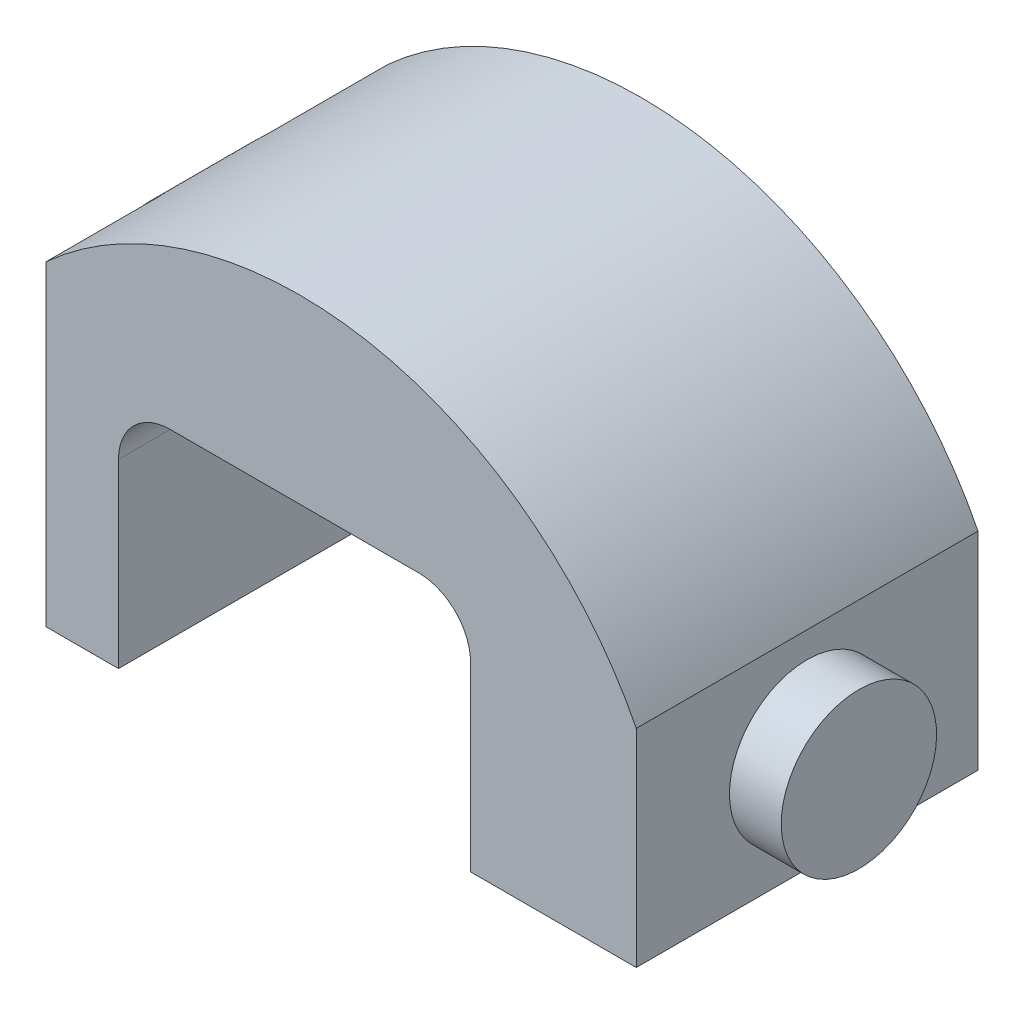
ISO-10303-21;
HEADER;
FILE_DESCRIPTION(('STEP AP214'),'2;1');
FILE_NAME('part.step','',(''),(''),'','','');
FILE_SCHEMA(('AUTOMOTIVE_DESIGN { 1 0 10303 214 1 1 1 1 }'));
ENDSEC;
DATA;
#1=APPLICATION_CONTEXT('core data for automotive mechanical design processes');
#2=APPLICATION_PROTOCOL_DEFINITION('international standard','automotive_design',2000,#1);
#3=PRODUCT_CONTEXT('',#1,'mechanical');
#4=PRODUCT('Part','Part','',(#3));
#5=PRODUCT_RELATED_PRODUCT_CATEGORY('part','',(#4));
#6=PRODUCT_DEFINITION_FORMATION('','',#4);
#7=PRODUCT_DEFINITION_CONTEXT('part definition',#1,'design');
#8=PRODUCT_DEFINITION('design','',#6,#7);
#9=PRODUCT_DEFINITION_SHAPE('','',#8);
#10=(LENGTH_UNIT() NAMED_UNIT(*) SI_UNIT(.MILLI.,.METRE.));
#11=(NAMED_UNIT(*) PLANE_ANGLE_UNIT() SI_UNIT($,.RADIAN.));
#12=(NAMED_UNIT(*) SI_UNIT($,.STERADIAN.) SOLID_ANGLE_UNIT());
#13=UNCERTAINTY_MEASURE_WITH_UNIT(LENGTH_MEASURE(1.E-05),#10,'distance_accuracy_value','');
#14=(GEOMETRIC_REPRESENTATION_CONTEXT(3) GLOBAL_UNCERTAINTY_ASSIGNED_CONTEXT((#13)) GLOBAL_UNIT_ASSIGNED_CONTEXT((#10,
#11,#12)) REPRESENTATION_CONTEXT('',''));
#15=CARTESIAN_POINT('',(0.,0.,0.));
#16=DIRECTION('',(0.,0.,1.));
#17=DIRECTION('',(1.,0.,0.));
#18=AXIS2_PLACEMENT_3D('',#15,#16,#17);
#19=CARTESIAN_POINT('',(0.,-40.,66.));
#20=DIRECTION('',(0.,1.,0.));
#21=DIRECTION('',(0.,0.,1.));
#22=AXIS2_PLACEMENT_3D('',#19,#20,#21);
#23=PLANE('',#22);
#24=DIRECTION('',(0.,0.,-1.));
#25=VECTOR('',#24,1.);
#26=CARTESIAN_POINT('',(35.5,-40.,19.9));
#27=LINE('',#26,#25);
#28=CARTESIAN_POINT('',(35.5,-40.,19.9));
#29=VERTEX_POINT('',#28);
#30=CARTESIAN_POINT('',(35.5,-40.,7.9));
#31=VERTEX_POINT('',#30);
#32=EDGE_CURVE('E223',#29,#31,#27,.T.);
#33=ORIENTED_EDGE('',*,*,#32,.F.);
#34=DIRECTION('',(-1.,0.,0.));
#35=VECTOR('',#34,1.);
#36=CARTESIAN_POINT('',(35.5,-40.,19.9));
#37=LINE('',#36,#35);
#38=CARTESIAN_POINT('',(47.5,-40.,19.9));
#39=VERTEX_POINT('',#38);
#40=EDGE_CURVE('E266',#39,#29,#37,.T.);
#41=ORIENTED_EDGE('',*,*,#40,.F.);
#42=DIRECTION('',(0.,0.,1.));
#43=VECTOR('',#42,1.);
#44=CARTESIAN_POINT('',(47.5,-40.,19.9));
#45=LINE('',#44,#43);
#46=CARTESIAN_POINT('',(47.5,-40.,7.9));
#47=VERTEX_POINT('',#46);
#48=EDGE_CURVE('E283',#47,#39,#45,.T.);
#49=ORIENTED_EDGE('',*,*,#48,.F.);
#50=DIRECTION('',(1.,0.,0.));
#51=VECTOR('',#50,1.);
#52=CARTESIAN_POINT('',(35.5,-40.,7.9));
#53=LINE('',#52,#51);
#54=EDGE_CURVE('E279',#31,#47,#53,.T.);
#55=ORIENTED_EDGE('',*,*,#54,.F.);
#56=EDGE_LOOP('',(#33,#41,#49,#55));
#57=FACE_BOUND('',#56,.T.);
#58=DIRECTION('',(1.,0.,0.));
#59=VECTOR('',#58,1.);
#60=CARTESIAN_POINT('',(0.,-40.,66.));
#61=LINE('',#60,#59);
#62=CARTESIAN_POINT('',(33.,-40.,66.));
#63=VERTEX_POINT('',#62);
#64=CARTESIAN_POINT('',(65.,-40.,66.));
#65=VERTEX_POINT('',#64);
#66=EDGE_CURVE('E461',#63,#65,#61,.T.);
#67=ORIENTED_EDGE('',*,*,#66,.F.);
#68=DIRECTION('',(0.,0.,1.));
#69=VECTOR('',#68,1.);
#70=CARTESIAN_POINT('',(33.,-40.,0.));
#71=LINE('',#70,#69);
#72=CARTESIAN_POINT('',(33.,-40.,0.));
#73=VERTEX_POINT('',#72);
#74=EDGE_CURVE('E430',#73,#63,#71,.T.);
#75=ORIENTED_EDGE('',*,*,#74,.F.);
#76=DIRECTION('',(1.,0.,0.));
#77=VECTOR('',#76,1.);
#78=CARTESIAN_POINT('',(0.,-40.,0.));
#79=LINE('',#78,#77);
#80=CARTESIAN_POINT('',(65.,-40.,0.));
#81=VERTEX_POINT('',#80);
#82=EDGE_CURVE('E473',#73,#81,#79,.T.);
#83=ORIENTED_EDGE('',*,*,#82,.T.);
#84=DIRECTION('',(0.,0.,-1.));
#85=VECTOR('',#84,1.);
#86=CARTESIAN_POINT('',(65.,-40.,66.));
#87=LINE('',#86,#85);
#88=EDGE_CURVE('E483',#65,#81,#87,.T.);
#89=ORIENTED_EDGE('',*,*,#88,.F.);
#90=EDGE_LOOP('',(#67,#75,#83,#89));
#91=FACE_BOUND('',#90,.T.);
#92=DIRECTION('',(0.,0.,-1.));
#93=VECTOR('',#92,1.);
#94=CARTESIAN_POINT('',(35.5,-40.,46.1));
#95=LINE('',#94,#93);
#96=CARTESIAN_POINT('',(35.5,-40.,58.1));
#97=VERTEX_POINT('',#96);
#98=CARTESIAN_POINT('',(35.5,-40.,46.1));
#99=VERTEX_POINT('',#98);
#100=EDGE_CURVE('E216',#97,#99,#95,.T.);
#101=ORIENTED_EDGE('',*,*,#100,.F.);
#102=DIRECTION('',(-1.,0.,0.));
#103=VECTOR('',#102,1.);
#104=CARTESIAN_POINT('',(47.5,-40.,58.1));
#105=LINE('',#104,#103);
#106=CARTESIAN_POINT('',(47.5,-40.,58.1));
#107=VERTEX_POINT('',#106);
#108=EDGE_CURVE('E218',#107,#97,#105,.T.);
#109=ORIENTED_EDGE('',*,*,#108,.F.);
#110=DIRECTION('',(0.,0.,1.));
#111=VECTOR('',#110,1.);
#112=CARTESIAN_POINT('',(47.5,-40.,46.1));
#113=LINE('',#112,#111);
#114=CARTESIAN_POINT('',(47.5,-40.,46.1));
#115=VERTEX_POINT('',#114);
#116=EDGE_CURVE('E68',#115,#107,#113,.T.);
#117=ORIENTED_EDGE('',*,*,#116,.F.);
#118=DIRECTION('',(1.,0.,0.));
#119=VECTOR('',#118,1.);
#120=CARTESIAN_POINT('',(47.5,-40.,46.1));
#121=LINE('',#120,#119);
#122=EDGE_CURVE('E63',#99,#115,#121,.T.);
#123=ORIENTED_EDGE('',*,*,#122,.F.);
#124=EDGE_LOOP('',(#101,#109,#117,#123));
#125=FACE_BOUND('',#124,.T.);
#126=ADVANCED_FACE('F47',(#57,#91,#125),#23,.F.);
#127=CARTESIAN_POINT('',(-49.,-40.,66.));
#128=VERTEX_POINT('',#127);
#129=CARTESIAN_POINT('',(-35.,-40.,66.));
#130=VERTEX_POINT('',#129);
#131=EDGE_CURVE('E463',#128,#130,#61,.T.);
#132=ORIENTED_EDGE('',*,*,#131,.F.);
#133=DIRECTION('',(0.,0.,1.));
#134=VECTOR('',#133,1.);
#135=CARTESIAN_POINT('',(-49.,-40.,66.));
#136=LINE('',#135,#134);
#137=CARTESIAN_POINT('',(-49.,-40.,43.));
#138=VERTEX_POINT('',#137);
#139=EDGE_CURVE('E355',#138,#128,#136,.T.);
#140=ORIENTED_EDGE('',*,*,#139,.F.);
#141=DIRECTION('',(1.,0.,0.));
#142=VECTOR('',#141,1.);
#143=CARTESIAN_POINT('',(-65.,-40.,43.));
#144=LINE('',#143,#142);
#145=CARTESIAN_POINT('',(-65.,-40.,43.));
#146=VERTEX_POINT('',#145);
#147=EDGE_CURVE('E351',#146,#138,#144,.T.);
#148=ORIENTED_EDGE('',*,*,#147,.F.);
#149=DIRECTION('',(0.,0.,-1.));
#150=VECTOR('',#149,1.);
#151=CARTESIAN_POINT('',(-65.,-40.,66.));
#152=LINE('',#151,#150);
#153=CARTESIAN_POINT('',(-65.,-40.,23.));
#154=VERTEX_POINT('',#153);
#155=EDGE_CURVE('E487',#146,#154,#152,.T.);
#156=ORIENTED_EDGE('',*,*,#155,.T.);
#157=DIRECTION('',(-1.,0.,0.));
#158=VECTOR('',#157,1.);
#159=CARTESIAN_POINT('',(-65.,-40.,23.));
#160=LINE('',#159,#158);
#161=CARTESIAN_POINT('',(-49.,-40.,23.));
#162=VERTEX_POINT('',#161);
#163=EDGE_CURVE('E369',#162,#154,#160,.T.);
#164=ORIENTED_EDGE('',*,*,#163,.F.);
#165=DIRECTION('',(0.,0.,1.));
#166=VECTOR('',#165,1.);
#167=CARTESIAN_POINT('',(-49.,-40.,0.));
#168=LINE('',#167,#166);
#169=CARTESIAN_POINT('',(-49.,-40.,0.));
#170=VERTEX_POINT('',#169);
#171=EDGE_CURVE('E356',#170,#162,#168,.T.);
#172=ORIENTED_EDGE('',*,*,#171,.F.);
#173=CARTESIAN_POINT('',(-35.,-40.,0.));
#174=VERTEX_POINT('',#173);
#175=EDGE_CURVE('E474',#170,#174,#79,.T.);
#176=ORIENTED_EDGE('',*,*,#175,.T.);
#177=DIRECTION('',(0.,0.,1.));
#178=VECTOR('',#177,1.);
#179=CARTESIAN_POINT('',(-35.,-40.,0.));
#180=LINE('',#179,#178);
#181=EDGE_CURVE('E434',#174,#130,#180,.T.);
#182=ORIENTED_EDGE('',*,*,#181,.T.);
#183=EDGE_LOOP('',(#132,#140,#148,#156,#164,#172,#176,#182));
#184=FACE_BOUND('',#183,.T.);
#185=DIRECTION('',(0.,0.,-1.));
#186=VECTOR('',#185,1.);
#187=CARTESIAN_POINT('',(-53.5,-40.,38.));
#188=LINE('',#187,#186);
#189=CARTESIAN_POINT('',(-53.5,-40.,38.));
#190=VERTEX_POINT('',#189);
#191=CARTESIAN_POINT('',(-53.5,-40.,28.));
#192=VERTEX_POINT('',#191);
#193=EDGE_CURVE('E305',#190,#192,#188,.T.);
#194=ORIENTED_EDGE('',*,*,#193,.F.);
#195=DIRECTION('',(-1.,0.,0.));
#196=VECTOR('',#195,1.);
#197=CARTESIAN_POINT('',(-53.5,-40.,38.));
#198=LINE('',#197,#196);
#199=CARTESIAN_POINT('',(-43.5,-40.,38.));
#200=VERTEX_POINT('',#199);
#201=EDGE_CURVE('E311',#200,#190,#198,.T.);
#202=ORIENTED_EDGE('',*,*,#201,.F.);
#203=DIRECTION('',(0.,0.,1.));
#204=VECTOR('',#203,1.);
#205=CARTESIAN_POINT('',(-43.5,-40.,38.));
#206=LINE('',#205,#204);
#207=CARTESIAN_POINT('',(-43.5,-40.,28.));
#208=VERTEX_POINT('',#207);
#209=EDGE_CURVE('E328',#208,#200,#206,.T.);
#210=ORIENTED_EDGE('',*,*,#209,.F.);
#211=DIRECTION('',(1.,0.,0.));
#212=VECTOR('',#211,1.);
#213=CARTESIAN_POINT('',(-53.5,-40.,28.));
#214=LINE('',#213,#212);
#215=EDGE_CURVE('E324',#192,#208,#214,.T.);
#216=ORIENTED_EDGE('',*,*,#215,.F.);
#217=EDGE_LOOP('',(#194,#202,#210,#216));
#218=FACE_BOUND('',#217,.T.);
#219=ADVANCED_FACE('F524',(#184,#218),#23,.F.);
#220=CARTESIAN_POINT('',(0.,-32.8125,66.));
#221=DIRECTION('',(0.,0.,-1.));
#222=DIRECTION('',(-1.,0.,0.));
#223=AXIS2_PLACEMENT_3D('',#220,#221,#222);
#224=CYLINDRICAL_SURFACE('',#223,72.8125);
#225=DIRECTION('',(0.,0.,-1.));
#226=VECTOR('',#225,1.);
#227=CARTESIAN_POINT('',(-49.,21.0452771194653,66.));
#228=LINE('',#227,#226);
#229=CARTESIAN_POINT('',(-49.,21.0452771194653,66.));
#230=VERTEX_POINT('',#229);
#231=CARTESIAN_POINT('',(-49.,21.0452771194653,43.));
#232=VERTEX_POINT('',#231);
#233=EDGE_CURVE('E380',#230,#232,#228,.T.);
#234=ORIENTED_EDGE('',*,*,#233,.F.);
#235=CARTESIAN_POINT('',(0.,-32.8125,66.));
#236=DIRECTION('',(0.,0.,1.));
#237=DIRECTION('',(1.,0.,0.));
#238=AXIS2_PLACEMENT_3D('',#235,#236,#237);
#239=CIRCLE('',#238,72.8125);
#240=CARTESIAN_POINT('',(65.,0.,66.));
#241=VERTEX_POINT('',#240);
#242=EDGE_CURVE('E458',#230,#241,#239,.F.);
#243=ORIENTED_EDGE('',*,*,#242,.T.);
#244=DIRECTION('',(0.,0.,-1.));
#245=VECTOR('',#244,1.);
#246=CARTESIAN_POINT('',(65.,0.,66.));
#247=LINE('',#246,#245);
#248=CARTESIAN_POINT('',(65.,0.,0.));
#249=VERTEX_POINT('',#248);
#250=EDGE_CURVE('E470',#241,#249,#247,.T.);
#251=ORIENTED_EDGE('',*,*,#250,.T.);
#252=CARTESIAN_POINT('',(0.,-32.8125,0.));
#253=DIRECTION('',(0.,0.,1.));
#254=DIRECTION('',(1.,0.,0.));
#255=AXIS2_PLACEMENT_3D('',#252,#253,#254);
#256=CIRCLE('',#255,72.8125);
#257=CARTESIAN_POINT('',(-49.,21.0452771194653,0.));
#258=VERTEX_POINT('',#257);
#259=EDGE_CURVE('E452',#258,#249,#256,.F.);
#260=ORIENTED_EDGE('',*,*,#259,.F.);
#261=DIRECTION('',(0.,0.,-1.));
#262=VECTOR('',#261,1.);
#263=CARTESIAN_POINT('',(-49.,21.0452771194653,66.));
#264=LINE('',#263,#262);
#265=CARTESIAN_POINT('',(-49.,21.0452771194653,23.));
#266=VERTEX_POINT('',#265);
#267=EDGE_CURVE('E363',#266,#258,#264,.T.);
#268=ORIENTED_EDGE('',*,*,#267,.F.);
#269=CARTESIAN_POINT('',(0.,-32.8125,23.));
#270=DIRECTION('',(0.,0.,1.));
#271=DIRECTION('',(1.,0.,0.));
#272=AXIS2_PLACEMENT_3D('',#269,#270,#271);
#273=CIRCLE('',#272,72.8125);
#274=CARTESIAN_POINT('',(-65.,0.,23.));
#275=VERTEX_POINT('',#274);
#276=EDGE_CURVE('E383',#275,#266,#273,.F.);
#277=ORIENTED_EDGE('',*,*,#276,.F.);
#278=DIRECTION('',(0.,0.,-1.));
#279=VECTOR('',#278,1.);
#280=CARTESIAN_POINT('',(-65.,0.,66.));
#281=LINE('',#280,#279);
#282=CARTESIAN_POINT('',(-65.,0.,43.));
#283=VERTEX_POINT('',#282);
#284=EDGE_CURVE('E457',#283,#275,#281,.T.);
#285=ORIENTED_EDGE('',*,*,#284,.F.);
#286=CARTESIAN_POINT('',(0.,-32.8125,43.));
#287=DIRECTION('',(0.,0.,-1.));
#288=DIRECTION('',(-1.,0.,0.));
#289=AXIS2_PLACEMENT_3D('',#286,#287,#288);
#290=CIRCLE('',#289,72.8125);
#291=EDGE_CURVE('E386',#232,#283,#290,.F.);
#292=ORIENTED_EDGE('',*,*,#291,.F.);
#293=EDGE_LOOP('',(#234,#243,#251,#260,#268,#277,#285,#292));
#294=FACE_BOUND('',#293,.T.);
#295=ADVANCED_FACE('F49',(#294),#224,.T.);
#296=CARTESIAN_POINT('',(-65.,0.,66.));
#297=DIRECTION('',(1.,0.,0.));
#298=DIRECTION('',(0.,0.,-1.));
#299=AXIS2_PLACEMENT_3D('',#296,#297,#298);
#300=PLANE('',#299);
#301=ORIENTED_EDGE('',*,*,#155,.F.);
#302=DIRECTION('',(0.,-1.,0.));
#303=VECTOR('',#302,1.);
#304=CARTESIAN_POINT('',(-65.,40.,43.));
#305=LINE('',#304,#303);
#306=EDGE_CURVE('E359',#283,#146,#305,.T.);
#307=ORIENTED_EDGE('',*,*,#306,.F.);
#308=ORIENTED_EDGE('',*,*,#284,.T.);
#309=DIRECTION('',(0.,-1.,0.));
#310=VECTOR('',#309,1.);
#311=CARTESIAN_POINT('',(-65.,40.,23.));
#312=LINE('',#311,#310);
#313=EDGE_CURVE('E350',#275,#154,#312,.T.);
#314=ORIENTED_EDGE('',*,*,#313,.T.);
#315=EDGE_LOOP('',(#301,#307,#308,#314));
#316=FACE_BOUND('',#315,.T.);
#317=ADVANCED_FACE('F535',(#316),#300,.F.);
#318=CARTESIAN_POINT('',(65.,0.,66.));
#319=DIRECTION('',(1.,0.,0.));
#320=DIRECTION('',(0.,1.,0.));
#321=AXIS2_PLACEMENT_3D('',#318,#319,#320);
#322=PLANE('',#321);
#323=CARTESIAN_POINT('',(65.,-20.,33.));
#324=DIRECTION('',(1.,0.,0.));
#325=DIRECTION('',(0.,1.,0.));
#326=AXIS2_PLACEMENT_3D('',#323,#324,#325);
#327=CIRCLE('',#326,15.);
#328=CARTESIAN_POINT('',(65.,-4.99999999999997,33.));
#329=VERTEX_POINT('',#328);
#330=EDGE_CURVE('E453',#329,#329,#327,.T.);
#331=ORIENTED_EDGE('',*,*,#330,.F.);
#332=EDGE_LOOP('',(#331));
#333=FACE_BOUND('',#332,.T.);
#334=DIRECTION('',(0.,-1.,0.));
#335=VECTOR('',#334,1.);
#336=CARTESIAN_POINT('',(65.,0.,0.));
#337=LINE('',#336,#335);
#338=EDGE_CURVE('E462',#249,#81,#337,.T.);
#339=ORIENTED_EDGE('',*,*,#338,.F.);
#340=ORIENTED_EDGE('',*,*,#250,.F.);
#341=DIRECTION('',(0.,-1.,0.));
#342=VECTOR('',#341,1.);
#343=CARTESIAN_POINT('',(65.,0.,66.));
#344=LINE('',#343,#342);
#345=EDGE_CURVE('E466',#241,#65,#344,.T.);
#346=ORIENTED_EDGE('',*,*,#345,.T.);
#347=ORIENTED_EDGE('',*,*,#88,.T.);
#348=EDGE_LOOP('',(#339,#340,#346,#347));
#349=FACE_BOUND('',#348,.T.);
#350=ADVANCED_FACE('F510',(#333,#349),#322,.T.);
#351=CARTESIAN_POINT('',(0.,0.,66.));
#352=DIRECTION('',(0.,0.,1.));
#353=DIRECTION('',(1.,0.,0.));
#354=AXIS2_PLACEMENT_3D('',#351,#352,#353);
#355=PLANE('',#354);
#356=DIRECTION('',(0.,1.,0.));
#357=VECTOR('',#356,1.);
#358=CARTESIAN_POINT('',(-49.,0.,66.));
#359=LINE('',#358,#357);
#360=EDGE_CURVE('E11',#128,#230,#359,.T.);
#361=ORIENTED_EDGE('',*,*,#360,.F.);
#362=ORIENTED_EDGE('',*,*,#131,.T.);
#363=DIRECTION('',(0.,-1.,0.));
#364=VECTOR('',#363,1.);
#365=CARTESIAN_POINT('',(-35.,-5.00000000000001,66.));
#366=LINE('',#365,#364);
#367=CARTESIAN_POINT('',(-35.,-5.00000000000001,66.));
#368=VERTEX_POINT('',#367);
#369=EDGE_CURVE('E395',#368,#130,#366,.T.);
#370=ORIENTED_EDGE('',*,*,#369,.F.);
#371=CARTESIAN_POINT('',(-25.,-5.00000000000001,66.));
#372=DIRECTION('',(0.,0.,1.));
#373=DIRECTION('',(-1.,0.,0.));
#374=AXIS2_PLACEMENT_3D('',#371,#372,#373);
#375=CIRCLE('',#374,10.);
#376=CARTESIAN_POINT('',(-25.,4.99999999999999,66.));
#377=VERTEX_POINT('',#376);
#378=EDGE_CURVE('E423',#377,#368,#375,.T.);
#379=ORIENTED_EDGE('',*,*,#378,.F.);
#380=DIRECTION('',(-1.,0.,0.));
#381=VECTOR('',#380,1.);
#382=CARTESIAN_POINT('',(-25.,4.99999999999999,66.));
#383=LINE('',#382,#381);
#384=CARTESIAN_POINT('',(23.,4.99999999999999,66.));
#385=VERTEX_POINT('',#384);
#386=EDGE_CURVE('E419',#385,#377,#383,.T.);
#387=ORIENTED_EDGE('',*,*,#386,.F.);
#388=CARTESIAN_POINT('',(23.,-5.00000000000001,66.));
#389=DIRECTION('',(0.,0.,1.));
#390=DIRECTION('',(-1.,0.,0.));
#391=AXIS2_PLACEMENT_3D('',#388,#389,#390);
#392=CIRCLE('',#391,10.);
#393=CARTESIAN_POINT('',(33.,-5.00000000000001,66.));
#394=VERTEX_POINT('',#393);
#395=EDGE_CURVE('E415',#394,#385,#392,.T.);
#396=ORIENTED_EDGE('',*,*,#395,.F.);
#397=DIRECTION('',(0.,1.,0.));
#398=VECTOR('',#397,1.);
#399=CARTESIAN_POINT('',(33.,-5.00000000000001,66.));
#400=LINE('',#399,#398);
#401=EDGE_CURVE('E389',#63,#394,#400,.T.);
#402=ORIENTED_EDGE('',*,*,#401,.F.);
#403=ORIENTED_EDGE('',*,*,#66,.T.);
#404=ORIENTED_EDGE('',*,*,#345,.F.);
#405=ORIENTED_EDGE('',*,*,#242,.F.);
#406=EDGE_LOOP('',(#361,#362,#370,#379,#387,#396,#402,#403,#404,#405));
#407=FACE_BOUND('',#406,.T.);
#408=ADVANCED_FACE('F521',(#407),#355,.T.);
#409=CARTESIAN_POINT('',(0.,0.,0.));
#410=DIRECTION('',(0.,0.,1.));
#411=DIRECTION('',(1.,0.,0.));
#412=AXIS2_PLACEMENT_3D('',#409,#410,#411);
#413=PLANE('',#412);
#414=ORIENTED_EDGE('',*,*,#175,.F.);
#415=DIRECTION('',(0.,1.,0.));
#416=VECTOR('',#415,1.);
#417=CARTESIAN_POINT('',(-49.,0.,0.));
#418=LINE('',#417,#416);
#419=EDGE_CURVE('E56',#170,#258,#418,.T.);
#420=ORIENTED_EDGE('',*,*,#419,.T.);
#421=ORIENTED_EDGE('',*,*,#259,.T.);
#422=ORIENTED_EDGE('',*,*,#338,.T.);
#423=ORIENTED_EDGE('',*,*,#82,.F.);
#424=DIRECTION('',(0.,1.,0.));
#425=VECTOR('',#424,1.);
#426=CARTESIAN_POINT('',(33.,-5.00000000000001,0.));
#427=LINE('',#426,#425);
#428=CARTESIAN_POINT('',(33.,-5.00000000000001,0.));
#429=VERTEX_POINT('',#428);
#430=EDGE_CURVE('E390',#73,#429,#427,.T.);
#431=ORIENTED_EDGE('',*,*,#430,.T.);
#432=CARTESIAN_POINT('',(23.,-5.00000000000001,0.));
#433=DIRECTION('',(0.,0.,1.));
#434=DIRECTION('',(-1.,0.,0.));
#435=AXIS2_PLACEMENT_3D('',#432,#433,#434);
#436=CIRCLE('',#435,10.);
#437=CARTESIAN_POINT('',(23.,5.,0.));
#438=VERTEX_POINT('',#437);
#439=EDGE_CURVE('E394',#429,#438,#436,.T.);
#440=ORIENTED_EDGE('',*,*,#439,.T.);
#441=DIRECTION('',(-1.,0.,0.));
#442=VECTOR('',#441,1.);
#443=CARTESIAN_POINT('',(-25.,4.99999999999999,0.));
#444=LINE('',#443,#442);
#445=CARTESIAN_POINT('',(-25.,4.99999999999999,0.));
#446=VERTEX_POINT('',#445);
#447=EDGE_CURVE('E399',#438,#446,#444,.T.);
#448=ORIENTED_EDGE('',*,*,#447,.T.);
#449=CARTESIAN_POINT('',(-25.,-5.00000000000001,0.));
#450=DIRECTION('',(0.,0.,1.));
#451=DIRECTION('',(-1.,0.,0.));
#452=AXIS2_PLACEMENT_3D('',#449,#450,#451);
#453=CIRCLE('',#452,10.);
#454=CARTESIAN_POINT('',(-35.,-5.00000000000001,0.));
#455=VERTEX_POINT('',#454);
#456=EDGE_CURVE('E403',#446,#455,#453,.T.);
#457=ORIENTED_EDGE('',*,*,#456,.T.);
#458=DIRECTION('',(0.,-1.,0.));
#459=VECTOR('',#458,1.);
#460=CARTESIAN_POINT('',(-35.,-5.00000000000001,0.));
#461=LINE('',#460,#459);
#462=EDGE_CURVE('E407',#455,#174,#461,.T.);
#463=ORIENTED_EDGE('',*,*,#462,.T.);
#464=EDGE_LOOP('',(#414,#420,#421,#422,#423,#431,#440,#448,#457,#463));
#465=FACE_BOUND('',#464,.T.);
#466=ADVANCED_FACE('F498',(#465),#413,.F.);
#467=CARTESIAN_POINT('',(75.,-20.,33.));
#468=DIRECTION('',(-1.,0.,0.));
#469=DIRECTION('',(0.,-1.,0.));
#470=AXIS2_PLACEMENT_3D('',#467,#468,#469);
#471=CYLINDRICAL_SURFACE('',#470,15.);
#472=CARTESIAN_POINT('',(75.,-20.,33.));
#473=DIRECTION('',(1.,0.,0.));
#474=DIRECTION('',(0.,1.,0.));
#475=AXIS2_PLACEMENT_3D('',#472,#473,#474);
#476=CIRCLE('',#475,15.);
#477=CARTESIAN_POINT('',(75.,-4.99999999999996,33.));
#478=VERTEX_POINT('',#477);
#479=EDGE_CURVE('E433',#478,#478,#476,.T.);
#480=ORIENTED_EDGE('',*,*,#479,.F.);
#481=EDGE_LOOP('',(#480));
#482=FACE_BOUND('',#481,.T.);
#483=ORIENTED_EDGE('',*,*,#330,.T.);
#484=EDGE_LOOP('',(#483));
#485=FACE_BOUND('',#484,.T.);
#486=ADVANCED_FACE('F605',(#482,#485),#471,.T.);
#487=CARTESIAN_POINT('',(75.,-20.,33.));
#488=DIRECTION('',(1.,0.,0.));
#489=DIRECTION('',(0.,1.,0.));
#490=AXIS2_PLACEMENT_3D('',#487,#488,#489);
#491=PLANE('',#490);
#492=ORIENTED_EDGE('',*,*,#479,.T.);
#493=EDGE_LOOP('',(#492));
#494=FACE_BOUND('',#493,.T.);
#495=ADVANCED_FACE('F601',(#494),#491,.T.);
#496=CARTESIAN_POINT('',(33.,-5.00000000000001,0.));
#497=DIRECTION('',(1.,0.,0.));
#498=DIRECTION('',(0.,1.,0.));
#499=AXIS2_PLACEMENT_3D('',#496,#497,#498);
#500=PLANE('',#499);
#501=ORIENTED_EDGE('',*,*,#401,.T.);
#502=DIRECTION('',(0.,0.,1.));
#503=VECTOR('',#502,1.);
#504=CARTESIAN_POINT('',(33.,-5.00000000000001,0.));
#505=LINE('',#504,#503);
#506=EDGE_CURVE('E411',#429,#394,#505,.T.);
#507=ORIENTED_EDGE('',*,*,#506,.F.);
#508=ORIENTED_EDGE('',*,*,#430,.F.);
#509=ORIENTED_EDGE('',*,*,#74,.T.);
#510=EDGE_LOOP('',(#501,#507,#508,#509));
#511=FACE_BOUND('',#510,.T.);
#512=ADVANCED_FACE('F589',(#511),#500,.F.);
#513=CARTESIAN_POINT('',(-35.,-5.00000000000001,0.));
#514=DIRECTION('',(-1.,0.,0.));
#515=DIRECTION('',(0.,0.,1.));
#516=AXIS2_PLACEMENT_3D('',#513,#514,#515);
#517=PLANE('',#516);
#518=ORIENTED_EDGE('',*,*,#369,.T.);
#519=ORIENTED_EDGE('',*,*,#181,.F.);
#520=ORIENTED_EDGE('',*,*,#462,.F.);
#521=DIRECTION('',(0.,0.,1.));
#522=VECTOR('',#521,1.);
#523=CARTESIAN_POINT('',(-35.,-5.00000000000001,0.));
#524=LINE('',#523,#522);
#525=EDGE_CURVE('E438',#455,#368,#524,.T.);
#526=ORIENTED_EDGE('',*,*,#525,.T.);
#527=EDGE_LOOP('',(#518,#519,#520,#526));
#528=FACE_BOUND('',#527,.T.);
#529=ADVANCED_FACE('F563',(#528),#517,.F.);
#530=CARTESIAN_POINT('',(-25.,-5.00000000000001,0.));
#531=DIRECTION('',(0.,0.,1.));
#532=DIRECTION('',(1.,0.,0.));
#533=AXIS2_PLACEMENT_3D('',#530,#531,#532);
#534=CYLINDRICAL_SURFACE('',#533,10.);
#535=ORIENTED_EDGE('',*,*,#378,.T.);
#536=ORIENTED_EDGE('',*,*,#525,.F.);
#537=ORIENTED_EDGE('',*,*,#456,.F.);
#538=DIRECTION('',(0.,0.,1.));
#539=VECTOR('',#538,1.);
#540=CARTESIAN_POINT('',(-25.,4.99999999999999,0.));
#541=LINE('',#540,#539);
#542=EDGE_CURVE('E441',#446,#377,#541,.T.);
#543=ORIENTED_EDGE('',*,*,#542,.T.);
#544=EDGE_LOOP('',(#535,#536,#537,#543));
#545=FACE_BOUND('',#544,.T.);
#546=ADVANCED_FACE('F567',(#545),#534,.F.);
#547=CARTESIAN_POINT('',(-25.,4.99999999999999,0.));
#548=DIRECTION('',(0.,1.,0.));
#549=DIRECTION('',(-1.,0.,0.));
#550=AXIS2_PLACEMENT_3D('',#547,#548,#549);
#551=PLANE('',#550);
#552=ORIENTED_EDGE('',*,*,#386,.T.);
#553=ORIENTED_EDGE('',*,*,#542,.F.);
#554=ORIENTED_EDGE('',*,*,#447,.F.);
#555=DIRECTION('',(0.,0.,1.));
#556=VECTOR('',#555,1.);
#557=CARTESIAN_POINT('',(23.,4.99999999999999,0.));
#558=LINE('',#557,#556);
#559=EDGE_CURVE('E444',#438,#385,#558,.T.);
#560=ORIENTED_EDGE('',*,*,#559,.T.);
#561=EDGE_LOOP('',(#552,#553,#554,#560));
#562=FACE_BOUND('',#561,.T.);
#563=ADVANCED_FACE('F592',(#562),#551,.F.);
#564=CARTESIAN_POINT('',(23.,-5.00000000000001,0.));
#565=DIRECTION('',(0.,0.,1.));
#566=DIRECTION('',(1.,0.,0.));
#567=AXIS2_PLACEMENT_3D('',#564,#565,#566);
#568=CYLINDRICAL_SURFACE('',#567,10.);
#569=ORIENTED_EDGE('',*,*,#395,.T.);
#570=ORIENTED_EDGE('',*,*,#559,.F.);
#571=ORIENTED_EDGE('',*,*,#439,.F.);
#572=ORIENTED_EDGE('',*,*,#506,.T.);
#573=EDGE_LOOP('',(#569,#570,#571,#572));
#574=FACE_BOUND('',#573,.T.);
#575=ADVANCED_FACE('F586',(#574),#568,.F.);
#576=CARTESIAN_POINT('',(-65.,40.,23.));
#577=DIRECTION('',(0.,0.,1.));
#578=DIRECTION('',(1.,0.,0.));
#579=AXIS2_PLACEMENT_3D('',#576,#577,#578);
#580=PLANE('',#579);
#581=ORIENTED_EDGE('',*,*,#276,.T.);
#582=DIRECTION('',(0.,-1.,0.));
#583=VECTOR('',#582,1.);
#584=CARTESIAN_POINT('',(-49.,40.,23.));
#585=LINE('',#584,#583);
#586=EDGE_CURVE('E366',#266,#162,#585,.T.);
#587=ORIENTED_EDGE('',*,*,#586,.T.);
#588=ORIENTED_EDGE('',*,*,#163,.T.);
#589=ORIENTED_EDGE('',*,*,#313,.F.);
#590=EDGE_LOOP('',(#581,#587,#588,#589));
#591=FACE_BOUND('',#590,.T.);
#592=ADVANCED_FACE('F558',(#591),#580,.F.);
#593=CARTESIAN_POINT('',(-49.,40.,0.));
#594=DIRECTION('',(1.,0.,0.));
#595=DIRECTION('',(0.,0.,-1.));
#596=AXIS2_PLACEMENT_3D('',#593,#594,#595);
#597=PLANE('',#596);
#598=ORIENTED_EDGE('',*,*,#267,.T.);
#599=ORIENTED_EDGE('',*,*,#419,.F.);
#600=ORIENTED_EDGE('',*,*,#171,.T.);
#601=ORIENTED_EDGE('',*,*,#586,.F.);
#602=EDGE_LOOP('',(#598,#599,#600,#601));
#603=FACE_BOUND('',#602,.T.);
#604=ADVANCED_FACE('F559',(#603),#597,.F.);
#605=CARTESIAN_POINT('',(-49.,40.,66.));
#606=DIRECTION('',(1.,0.,0.));
#607=DIRECTION('',(0.,0.,-1.));
#608=AXIS2_PLACEMENT_3D('',#605,#606,#607);
#609=PLANE('',#608);
#610=ORIENTED_EDGE('',*,*,#233,.T.);
#611=DIRECTION('',(0.,-1.,0.));
#612=VECTOR('',#611,1.);
#613=CARTESIAN_POINT('',(-49.,40.,43.));
#614=LINE('',#613,#612);
#615=EDGE_CURVE('E360',#232,#138,#614,.T.);
#616=ORIENTED_EDGE('',*,*,#615,.T.);
#617=ORIENTED_EDGE('',*,*,#139,.T.);
#618=ORIENTED_EDGE('',*,*,#360,.T.);
#619=EDGE_LOOP('',(#610,#616,#617,#618));
#620=FACE_BOUND('',#619,.T.);
#621=ADVANCED_FACE('F571',(#620),#609,.F.);
#622=CARTESIAN_POINT('',(-65.,40.,43.));
#623=DIRECTION('',(0.,0.,-1.));
#624=DIRECTION('',(-1.,0.,0.));
#625=AXIS2_PLACEMENT_3D('',#622,#623,#624);
#626=PLANE('',#625);
#627=ORIENTED_EDGE('',*,*,#291,.T.);
#628=ORIENTED_EDGE('',*,*,#306,.T.);
#629=ORIENTED_EDGE('',*,*,#147,.T.);
#630=ORIENTED_EDGE('',*,*,#615,.F.);
#631=EDGE_LOOP('',(#627,#628,#629,#630));
#632=FACE_BOUND('',#631,.T.);
#633=ADVANCED_FACE('F554',(#632),#626,.F.);
#634=CARTESIAN_POINT('',(-53.5,-45.,38.));
#635=DIRECTION('',(1.,0.,0.));
#636=DIRECTION('',(0.,0.,-1.));
#637=AXIS2_PLACEMENT_3D('',#634,#635,#636);
#638=PLANE('',#637);
#639=ORIENTED_EDGE('',*,*,#193,.T.);
#640=DIRECTION('',(0.,1.,0.));
#641=VECTOR('',#640,1.);
#642=CARTESIAN_POINT('',(-53.5,-45.,28.));
#643=LINE('',#642,#641);
#644=CARTESIAN_POINT('',(-53.5,-45.,28.));
#645=VERTEX_POINT('',#644);
#646=EDGE_CURVE('E346',#645,#192,#643,.T.);
#647=ORIENTED_EDGE('',*,*,#646,.F.);
#648=DIRECTION('',(0.,0.,-1.));
#649=VECTOR('',#648,1.);
#650=CARTESIAN_POINT('',(-53.5,-45.,38.));
#651=LINE('',#650,#649);
#652=CARTESIAN_POINT('',(-53.5,-45.,38.));
#653=VERTEX_POINT('',#652);
#654=EDGE_CURVE('E306',#653,#645,#651,.T.);
#655=ORIENTED_EDGE('',*,*,#654,.F.);
#656=DIRECTION('',(0.,1.,0.));
#657=VECTOR('',#656,1.);
#658=CARTESIAN_POINT('',(-53.5,-45.,38.));
#659=LINE('',#658,#657);
#660=EDGE_CURVE('E320',#653,#190,#659,.T.);
#661=ORIENTED_EDGE('',*,*,#660,.T.);
#662=EDGE_LOOP('',(#639,#647,#655,#661));
#663=FACE_BOUND('',#662,.T.);
#664=ADVANCED_FACE('F578',(#663),#638,.F.);
#665=CARTESIAN_POINT('',(-53.5,-45.,28.));
#666=DIRECTION('',(0.,0.,1.));
#667=DIRECTION('',(1.,0.,0.));
#668=AXIS2_PLACEMENT_3D('',#665,#666,#667);
#669=PLANE('',#668);
#670=ORIENTED_EDGE('',*,*,#215,.T.);
#671=DIRECTION('',(0.,1.,0.));
#672=VECTOR('',#671,1.);
#673=CARTESIAN_POINT('',(-43.5,-45.,28.));
#674=LINE('',#673,#672);
#675=CARTESIAN_POINT('',(-43.5,-45.,28.));
#676=VERTEX_POINT('',#675);
#677=EDGE_CURVE('E342',#676,#208,#674,.T.);
#678=ORIENTED_EDGE('',*,*,#677,.F.);
#679=DIRECTION('',(1.,0.,0.));
#680=VECTOR('',#679,1.);
#681=CARTESIAN_POINT('',(-53.5,-45.,28.));
#682=LINE('',#681,#680);
#683=EDGE_CURVE('E310',#645,#676,#682,.T.);
#684=ORIENTED_EDGE('',*,*,#683,.F.);
#685=ORIENTED_EDGE('',*,*,#646,.T.);
#686=EDGE_LOOP('',(#670,#678,#684,#685));
#687=FACE_BOUND('',#686,.T.);
#688=ADVANCED_FACE('F652',(#687),#669,.F.);
#689=CARTESIAN_POINT('',(-43.5,-45.,38.));
#690=DIRECTION('',(-1.,0.,0.));
#691=DIRECTION('',(0.,0.,1.));
#692=AXIS2_PLACEMENT_3D('',#689,#690,#691);
#693=PLANE('',#692);
#694=ORIENTED_EDGE('',*,*,#209,.T.);
#695=DIRECTION('',(0.,1.,0.));
#696=VECTOR('',#695,1.);
#697=CARTESIAN_POINT('',(-43.5,-45.,38.));
#698=LINE('',#697,#696);
#699=CARTESIAN_POINT('',(-43.5,-45.,38.));
#700=VERTEX_POINT('',#699);
#701=EDGE_CURVE('E338',#700,#200,#698,.T.);
#702=ORIENTED_EDGE('',*,*,#701,.F.);
#703=DIRECTION('',(0.,0.,1.));
#704=VECTOR('',#703,1.);
#705=CARTESIAN_POINT('',(-43.5,-45.,38.));
#706=LINE('',#705,#704);
#707=EDGE_CURVE('E314',#676,#700,#706,.T.);
#708=ORIENTED_EDGE('',*,*,#707,.F.);
#709=ORIENTED_EDGE('',*,*,#677,.T.);
#710=EDGE_LOOP('',(#694,#702,#708,#709));
#711=FACE_BOUND('',#710,.T.);
#712=ADVANCED_FACE('F661',(#711),#693,.F.);
#713=CARTESIAN_POINT('',(-53.5,-45.,38.));
#714=DIRECTION('',(0.,0.,-1.));
#715=DIRECTION('',(-1.,0.,0.));
#716=AXIS2_PLACEMENT_3D('',#713,#714,#715);
#717=PLANE('',#716);
#718=ORIENTED_EDGE('',*,*,#201,.T.);
#719=ORIENTED_EDGE('',*,*,#660,.F.);
#720=DIRECTION('',(-1.,0.,0.));
#721=VECTOR('',#720,1.);
#722=CARTESIAN_POINT('',(-53.5,-45.,38.));
#723=LINE('',#722,#721);
#724=EDGE_CURVE('E317',#700,#653,#723,.T.);
#725=ORIENTED_EDGE('',*,*,#724,.F.);
#726=ORIENTED_EDGE('',*,*,#701,.T.);
#727=EDGE_LOOP('',(#718,#719,#725,#726));
#728=FACE_BOUND('',#727,.T.);
#729=ADVANCED_FACE('F670',(#728),#717,.F.);
#730=CARTESIAN_POINT('',(0.,-45.,0.));
#731=DIRECTION('',(0.,-1.,0.));
#732=DIRECTION('',(0.,0.,-1.));
#733=AXIS2_PLACEMENT_3D('',#730,#731,#732);
#734=PLANE('',#733);
#735=ORIENTED_EDGE('',*,*,#654,.T.);
#736=ORIENTED_EDGE('',*,*,#683,.T.);
#737=ORIENTED_EDGE('',*,*,#707,.T.);
#738=ORIENTED_EDGE('',*,*,#724,.T.);
#739=EDGE_LOOP('',(#735,#736,#737,#738));
#740=FACE_BOUND('',#739,.T.);
#741=ADVANCED_FACE('F680',(#740),#734,.T.);
#742=CARTESIAN_POINT('',(35.5,-45.,19.9));
#743=DIRECTION('',(1.,0.,0.));
#744=DIRECTION('',(0.,0.,-1.));
#745=AXIS2_PLACEMENT_3D('',#742,#743,#744);
#746=PLANE('',#745);
#747=ORIENTED_EDGE('',*,*,#32,.T.);
#748=DIRECTION('',(0.,1.,0.));
#749=VECTOR('',#748,1.);
#750=CARTESIAN_POINT('',(35.5,-45.,7.9));
#751=LINE('',#750,#749);
#752=CARTESIAN_POINT('',(35.5,-45.,7.9));
#753=VERTEX_POINT('',#752);
#754=EDGE_CURVE('E301',#753,#31,#751,.T.);
#755=ORIENTED_EDGE('',*,*,#754,.F.);
#756=DIRECTION('',(0.,0.,-1.));
#757=VECTOR('',#756,1.);
#758=CARTESIAN_POINT('',(35.5,-45.,19.9));
#759=LINE('',#758,#757);
#760=CARTESIAN_POINT('',(35.5,-45.,19.9));
#761=VERTEX_POINT('',#760);
#762=EDGE_CURVE('E261',#761,#753,#759,.T.);
#763=ORIENTED_EDGE('',*,*,#762,.F.);
#764=DIRECTION('',(0.,1.,0.));
#765=VECTOR('',#764,1.);
#766=CARTESIAN_POINT('',(35.5,-45.,19.9));
#767=LINE('',#766,#765);
#768=EDGE_CURVE('E275',#761,#29,#767,.T.);
#769=ORIENTED_EDGE('',*,*,#768,.T.);
#770=EDGE_LOOP('',(#747,#755,#763,#769));
#771=FACE_BOUND('',#770,.T.);
#772=ADVANCED_FACE('F689',(#771),#746,.F.);
#773=CARTESIAN_POINT('',(35.5,-45.,7.9));
#774=DIRECTION('',(0.,0.,1.));
#775=DIRECTION('',(1.,0.,0.));
#776=AXIS2_PLACEMENT_3D('',#773,#774,#775);
#777=PLANE('',#776);
#778=ORIENTED_EDGE('',*,*,#54,.T.);
#779=DIRECTION('',(0.,1.,0.));
#780=VECTOR('',#779,1.);
#781=CARTESIAN_POINT('',(47.5,-45.,7.9));
#782=LINE('',#781,#780);
#783=CARTESIAN_POINT('',(47.5,-45.,7.9));
#784=VERTEX_POINT('',#783);
#785=EDGE_CURVE('E297',#784,#47,#782,.T.);
#786=ORIENTED_EDGE('',*,*,#785,.F.);
#787=DIRECTION('',(1.,0.,0.));
#788=VECTOR('',#787,1.);
#789=CARTESIAN_POINT('',(35.5,-45.,7.9));
#790=LINE('',#789,#788);
#791=EDGE_CURVE('E265',#753,#784,#790,.T.);
#792=ORIENTED_EDGE('',*,*,#791,.F.);
#793=ORIENTED_EDGE('',*,*,#754,.T.);
#794=EDGE_LOOP('',(#778,#786,#792,#793));
#795=FACE_BOUND('',#794,.T.);
#796=ADVANCED_FACE('F702',(#795),#777,.F.);
#797=CARTESIAN_POINT('',(47.5,-45.,19.9));
#798=DIRECTION('',(-1.,0.,0.));
#799=DIRECTION('',(0.,0.,1.));
#800=AXIS2_PLACEMENT_3D('',#797,#798,#799);
#801=PLANE('',#800);
#802=ORIENTED_EDGE('',*,*,#48,.T.);
#803=DIRECTION('',(0.,1.,0.));
#804=VECTOR('',#803,1.);
#805=CARTESIAN_POINT('',(47.5,-45.,19.9));
#806=LINE('',#805,#804);
#807=CARTESIAN_POINT('',(47.5,-45.,19.9));
#808=VERTEX_POINT('',#807);
#809=EDGE_CURVE('E293',#808,#39,#806,.T.);
#810=ORIENTED_EDGE('',*,*,#809,.F.);
#811=DIRECTION('',(0.,0.,1.));
#812=VECTOR('',#811,1.);
#813=CARTESIAN_POINT('',(47.5,-45.,19.9));
#814=LINE('',#813,#812);
#815=EDGE_CURVE('E269',#784,#808,#814,.T.);
#816=ORIENTED_EDGE('',*,*,#815,.F.);
#817=ORIENTED_EDGE('',*,*,#785,.T.);
#818=EDGE_LOOP('',(#802,#810,#816,#817));
#819=FACE_BOUND('',#818,.T.);
#820=ADVANCED_FACE('F712',(#819),#801,.F.);
#821=CARTESIAN_POINT('',(35.5,-45.,19.9));
#822=DIRECTION('',(0.,0.,-1.));
#823=DIRECTION('',(-1.,0.,0.));
#824=AXIS2_PLACEMENT_3D('',#821,#822,#823);
#825=PLANE('',#824);
#826=ORIENTED_EDGE('',*,*,#40,.T.);
#827=ORIENTED_EDGE('',*,*,#768,.F.);
#828=DIRECTION('',(-1.,0.,0.));
#829=VECTOR('',#828,1.);
#830=CARTESIAN_POINT('',(35.5,-45.,19.9));
#831=LINE('',#830,#829);
#832=EDGE_CURVE('E272',#808,#761,#831,.T.);
#833=ORIENTED_EDGE('',*,*,#832,.F.);
#834=ORIENTED_EDGE('',*,*,#809,.T.);
#835=EDGE_LOOP('',(#826,#827,#833,#834));
#836=FACE_BOUND('',#835,.T.);
#837=ADVANCED_FACE('F722',(#836),#825,.F.);
#838=CARTESIAN_POINT('',(0.,-45.,0.));
#839=DIRECTION('',(0.,-1.,0.));
#840=DIRECTION('',(0.,0.,-1.));
#841=AXIS2_PLACEMENT_3D('',#838,#839,#840);
#842=PLANE('',#841);
#843=ORIENTED_EDGE('',*,*,#762,.T.);
#844=ORIENTED_EDGE('',*,*,#791,.T.);
#845=ORIENTED_EDGE('',*,*,#815,.T.);
#846=ORIENTED_EDGE('',*,*,#832,.T.);
#847=EDGE_LOOP('',(#843,#844,#845,#846));
#848=FACE_BOUND('',#847,.T.);
#849=ADVANCED_FACE('F732',(#848),#842,.T.);
#850=CARTESIAN_POINT('',(35.5,-45.,46.1));
#851=DIRECTION('',(1.,0.,0.));
#852=DIRECTION('',(0.,0.,-1.));
#853=AXIS2_PLACEMENT_3D('',#850,#851,#852);
#854=PLANE('',#853);
#855=ORIENTED_EDGE('',*,*,#100,.T.);
#856=DIRECTION('',(0.,1.,0.));
#857=VECTOR('',#856,1.);
#858=CARTESIAN_POINT('',(35.5,-45.,46.1));
#859=LINE('',#858,#857);
#860=CARTESIAN_POINT('',(35.5,-45.,46.1));
#861=VERTEX_POINT('',#860);
#862=EDGE_CURVE('E792',#861,#99,#859,.T.);
#863=ORIENTED_EDGE('',*,*,#862,.F.);
#864=DIRECTION('',(0.,0.,-1.));
#865=VECTOR('',#864,1.);
#866=CARTESIAN_POINT('',(35.5,-45.,46.1));
#867=LINE('',#866,#865);
#868=CARTESIAN_POINT('',(35.5,-45.,58.1));
#869=VERTEX_POINT('',#868);
#870=EDGE_CURVE('E235',#869,#861,#867,.T.);
#871=ORIENTED_EDGE('',*,*,#870,.F.);
#872=DIRECTION('',(0.,1.,0.));
#873=VECTOR('',#872,1.);
#874=CARTESIAN_POINT('',(35.5,-45.,58.1));
#875=LINE('',#874,#873);
#876=EDGE_CURVE('E230',#869,#97,#875,.T.);
#877=ORIENTED_EDGE('',*,*,#876,.T.);
#878=EDGE_LOOP('',(#855,#863,#871,#877));
#879=FACE_BOUND('',#878,.T.);
#880=ADVANCED_FACE('F237',(#879),#854,.F.);
#881=CARTESIAN_POINT('',(47.5,-45.,46.1));
#882=DIRECTION('',(0.,0.,1.));
#883=DIRECTION('',(1.,0.,0.));
#884=AXIS2_PLACEMENT_3D('',#881,#882,#883);
#885=PLANE('',#884);
#886=ORIENTED_EDGE('',*,*,#122,.T.);
#887=DIRECTION('',(0.,1.,0.));
#888=VECTOR('',#887,1.);
#889=CARTESIAN_POINT('',(47.5,-45.,46.1));
#890=LINE('',#889,#888);
#891=CARTESIAN_POINT('',(47.5,-45.,46.1));
#892=VERTEX_POINT('',#891);
#893=EDGE_CURVE('E246',#892,#115,#890,.T.);
#894=ORIENTED_EDGE('',*,*,#893,.F.);
#895=DIRECTION('',(1.,0.,0.));
#896=VECTOR('',#895,1.);
#897=CARTESIAN_POINT('',(47.5,-45.,46.1));
#898=LINE('',#897,#896);
#899=EDGE_CURVE('E256',#861,#892,#898,.T.);
#900=ORIENTED_EDGE('',*,*,#899,.F.);
#901=ORIENTED_EDGE('',*,*,#862,.T.);
#902=EDGE_LOOP('',(#886,#894,#900,#901));
#903=FACE_BOUND('',#902,.T.);
#904=ADVANCED_FACE('F751',(#903),#885,.F.);
#905=CARTESIAN_POINT('',(47.5,-45.,46.1));
#906=DIRECTION('',(-1.,0.,0.));
#907=DIRECTION('',(0.,0.,1.));
#908=AXIS2_PLACEMENT_3D('',#905,#906,#907);
#909=PLANE('',#908);
#910=ORIENTED_EDGE('',*,*,#116,.T.);
#911=DIRECTION('',(0.,1.,0.));
#912=VECTOR('',#911,1.);
#913=CARTESIAN_POINT('',(47.5,-45.,58.1));
#914=LINE('',#913,#912);
#915=CARTESIAN_POINT('',(47.5,-45.,58.1));
#916=VERTEX_POINT('',#915);
#917=EDGE_CURVE('E233',#916,#107,#914,.T.);
#918=ORIENTED_EDGE('',*,*,#917,.F.);
#919=DIRECTION('',(0.,0.,1.));
#920=VECTOR('',#919,1.);
#921=CARTESIAN_POINT('',(47.5,-45.,46.1));
#922=LINE('',#921,#920);
#923=EDGE_CURVE('E244',#892,#916,#922,.T.);
#924=ORIENTED_EDGE('',*,*,#923,.F.);
#925=ORIENTED_EDGE('',*,*,#893,.T.);
#926=EDGE_LOOP('',(#910,#918,#924,#925));
#927=FACE_BOUND('',#926,.T.);
#928=ADVANCED_FACE('F760',(#927),#909,.F.);
#929=CARTESIAN_POINT('',(47.5,-45.,58.1));
#930=DIRECTION('',(0.,0.,-1.));
#931=DIRECTION('',(-1.,0.,0.));
#932=AXIS2_PLACEMENT_3D('',#929,#930,#931);
#933=PLANE('',#932);
#934=ORIENTED_EDGE('',*,*,#108,.T.);
#935=ORIENTED_EDGE('',*,*,#876,.F.);
#936=DIRECTION('',(-1.,0.,0.));
#937=VECTOR('',#936,1.);
#938=CARTESIAN_POINT('',(47.5,-45.,58.1));
#939=LINE('',#938,#937);
#940=EDGE_CURVE('E240',#916,#869,#939,.T.);
#941=ORIENTED_EDGE('',*,*,#940,.F.);
#942=ORIENTED_EDGE('',*,*,#917,.T.);
#943=EDGE_LOOP('',(#934,#935,#941,#942));
#944=FACE_BOUND('',#943,.T.);
#945=ADVANCED_FACE('F228',(#944),#933,.F.);
#946=CARTESIAN_POINT('',(0.,-45.,0.));
#947=DIRECTION('',(0.,-1.,0.));
#948=DIRECTION('',(0.,0.,-1.));
#949=AXIS2_PLACEMENT_3D('',#946,#947,#948);
#950=PLANE('',#949);
#951=ORIENTED_EDGE('',*,*,#870,.T.);
#952=ORIENTED_EDGE('',*,*,#899,.T.);
#953=ORIENTED_EDGE('',*,*,#923,.T.);
#954=ORIENTED_EDGE('',*,*,#940,.T.);
#955=EDGE_LOOP('',(#951,#952,#953,#954));
#956=FACE_BOUND('',#955,.T.);
#957=ADVANCED_FACE('F779',(#956),#950,.T.);
#958=CLOSED_SHELL('',(#126,#219,#295,#317,#350,#408,#466,#486,#495,#512,#529,#546,#563,#575,
#592,#604,#621,#633,#664,#688,#712,#729,#741,#772,#796,#820,#837,#849,#880,#904,#928,#945,#957));
#959=MANIFOLD_SOLID_BREP('B2',#958);
#960=ADVANCED_BREP_SHAPE_REPRESENTATION('',(#18,#959),#14);
#961=SHAPE_DEFINITION_REPRESENTATION(#9,#960);
ENDSEC;
END-ISO-10303-21;
